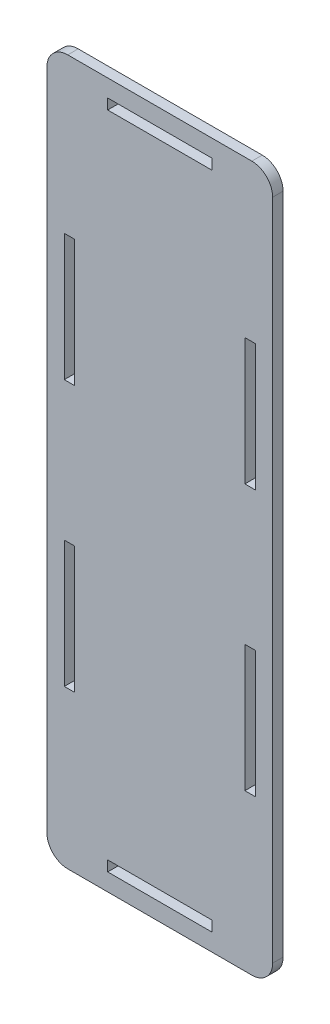
ISO-10303-21;
HEADER;
FILE_DESCRIPTION(('STEP AP214'),'2;1');
FILE_NAME('part.step','',(''),(''),'','','');
FILE_SCHEMA(('AUTOMOTIVE_DESIGN { 1 0 10303 214 1 1 1 1 }'));
ENDSEC;
DATA;
#1=APPLICATION_CONTEXT('core data for automotive mechanical design processes');
#2=APPLICATION_PROTOCOL_DEFINITION('international standard','automotive_design',2000,#1);
#3=PRODUCT_CONTEXT('',#1,'mechanical');
#4=PRODUCT('Part','Part','',(#3));
#5=PRODUCT_RELATED_PRODUCT_CATEGORY('part','',(#4));
#6=PRODUCT_DEFINITION_FORMATION('','',#4);
#7=PRODUCT_DEFINITION_CONTEXT('part definition',#1,'design');
#8=PRODUCT_DEFINITION('design','',#6,#7);
#9=PRODUCT_DEFINITION_SHAPE('','',#8);
#10=(LENGTH_UNIT() NAMED_UNIT(*) SI_UNIT(.MILLI.,.METRE.));
#11=(NAMED_UNIT(*) PLANE_ANGLE_UNIT() SI_UNIT($,.RADIAN.));
#12=(NAMED_UNIT(*) SI_UNIT($,.STERADIAN.) SOLID_ANGLE_UNIT());
#13=UNCERTAINTY_MEASURE_WITH_UNIT(LENGTH_MEASURE(1.E-05),#10,'distance_accuracy_value','');
#14=(GEOMETRIC_REPRESENTATION_CONTEXT(3) GLOBAL_UNCERTAINTY_ASSIGNED_CONTEXT((#13)) GLOBAL_UNIT_ASSIGNED_CONTEXT((#10,
#11,#12)) REPRESENTATION_CONTEXT('',''));
#15=CARTESIAN_POINT('',(0.,0.,0.));
#16=DIRECTION('',(0.,0.,1.));
#17=DIRECTION('',(1.,0.,0.));
#18=AXIS2_PLACEMENT_3D('',#15,#16,#17);
#19=CARTESIAN_POINT('',(-26.5,-95.5,3.));
#20=DIRECTION('',(0.,0.,-1.));
#21=DIRECTION('',(-1.,0.,0.));
#22=AXIS2_PLACEMENT_3D('',#19,#20,#21);
#23=PLANE('',#22);
#24=DIRECTION('',(0.,1.,0.));
#25=VECTOR('',#24,1.);
#26=CARTESIAN_POINT('',(27.5,-56.5,3.));
#27=LINE('',#26,#25);
#28=CARTESIAN_POINT('',(27.5,-56.5,3.));
#29=VERTEX_POINT('',#28);
#30=CARTESIAN_POINT('',(27.5,-20.,3.));
#31=VERTEX_POINT('',#30);
#32=EDGE_CURVE('E325',#29,#31,#27,.T.);
#33=ORIENTED_EDGE('',*,*,#32,.F.);
#34=DIRECTION('',(1.,0.,0.));
#35=VECTOR('',#34,1.);
#36=CARTESIAN_POINT('',(24.5,-56.5,3.));
#37=LINE('',#36,#35);
#38=CARTESIAN_POINT('',(24.5,-56.5,3.));
#39=VERTEX_POINT('',#38);
#40=EDGE_CURVE('E48',#39,#29,#37,.T.);
#41=ORIENTED_EDGE('',*,*,#40,.F.);
#42=DIRECTION('',(0.,1.,0.));
#43=VECTOR('',#42,1.);
#44=CARTESIAN_POINT('',(24.5,-56.5,3.));
#45=LINE('',#44,#43);
#46=CARTESIAN_POINT('',(24.5,-20.,3.));
#47=VERTEX_POINT('',#46);
#48=EDGE_CURVE('E318',#39,#47,#45,.T.);
#49=ORIENTED_EDGE('',*,*,#48,.T.);
#50=DIRECTION('',(1.,0.,0.));
#51=VECTOR('',#50,1.);
#52=CARTESIAN_POINT('',(24.5,-20.,3.));
#53=LINE('',#52,#51);
#54=EDGE_CURVE('E321',#47,#31,#53,.T.);
#55=ORIENTED_EDGE('',*,*,#54,.T.);
#56=EDGE_LOOP('',(#33,#41,#49,#55));
#57=FACE_BOUND('',#56,.T.);
#58=DIRECTION('',(0.,1.,0.));
#59=VECTOR('',#58,1.);
#60=CARTESIAN_POINT('',(15.,0.,3.));
#61=LINE('',#60,#59);
#62=CARTESIAN_POINT('',(15.,93.5,3.));
#63=VERTEX_POINT('',#62);
#64=CARTESIAN_POINT('',(15.,96.5,3.));
#65=VERTEX_POINT('',#64);
#66=EDGE_CURVE('E296',#63,#65,#61,.T.);
#67=ORIENTED_EDGE('',*,*,#66,.F.);
#68=DIRECTION('',(1.,0.,0.));
#69=VECTOR('',#68,1.);
#70=CARTESIAN_POINT('',(0.,93.5,3.));
#71=LINE('',#70,#69);
#72=CARTESIAN_POINT('',(-15.,93.5,3.));
#73=VERTEX_POINT('',#72);
#74=EDGE_CURVE('E56',#73,#63,#71,.T.);
#75=ORIENTED_EDGE('',*,*,#74,.F.);
#76=DIRECTION('',(0.,1.,0.));
#77=VECTOR('',#76,1.);
#78=CARTESIAN_POINT('',(-15.,0.,3.));
#79=LINE('',#78,#77);
#80=CARTESIAN_POINT('',(-15.,96.5,3.));
#81=VERTEX_POINT('',#80);
#82=EDGE_CURVE('E289',#73,#81,#79,.T.);
#83=ORIENTED_EDGE('',*,*,#82,.T.);
#84=DIRECTION('',(1.,0.,0.));
#85=VECTOR('',#84,1.);
#86=CARTESIAN_POINT('',(0.,96.5,3.));
#87=LINE('',#86,#85);
#88=EDGE_CURVE('E292',#81,#65,#87,.T.);
#89=ORIENTED_EDGE('',*,*,#88,.T.);
#90=EDGE_LOOP('',(#67,#75,#83,#89));
#91=FACE_BOUND('',#90,.T.);
#92=DIRECTION('',(1.,0.,0.));
#93=VECTOR('',#92,1.);
#94=CARTESIAN_POINT('',(24.5,56.5,3.));
#95=LINE('',#94,#93);
#96=CARTESIAN_POINT('',(24.5,56.5,3.));
#97=VERTEX_POINT('',#96);
#98=CARTESIAN_POINT('',(27.5,56.5,3.));
#99=VERTEX_POINT('',#98);
#100=EDGE_CURVE('E268',#97,#99,#95,.T.);
#101=ORIENTED_EDGE('',*,*,#100,.T.);
#102=DIRECTION('',(0.,-1.,0.));
#103=VECTOR('',#102,1.);
#104=CARTESIAN_POINT('',(27.5,56.5,3.));
#105=LINE('',#104,#103);
#106=CARTESIAN_POINT('',(27.5,20.,3.));
#107=VERTEX_POINT('',#106);
#108=EDGE_CURVE('E266',#99,#107,#105,.T.);
#109=ORIENTED_EDGE('',*,*,#108,.T.);
#110=DIRECTION('',(1.,0.,0.));
#111=VECTOR('',#110,1.);
#112=CARTESIAN_POINT('',(24.5,20.,3.));
#113=LINE('',#112,#111);
#114=CARTESIAN_POINT('',(24.5,20.,3.));
#115=VERTEX_POINT('',#114);
#116=EDGE_CURVE('E247',#115,#107,#113,.T.);
#117=ORIENTED_EDGE('',*,*,#116,.F.);
#118=DIRECTION('',(0.,-1.,0.));
#119=VECTOR('',#118,1.);
#120=CARTESIAN_POINT('',(24.5,56.5,3.));
#121=LINE('',#120,#119);
#122=EDGE_CURVE('E259',#97,#115,#121,.T.);
#123=ORIENTED_EDGE('',*,*,#122,.F.);
#124=EDGE_LOOP('',(#101,#109,#117,#123));
#125=FACE_BOUND('',#124,.T.);
#126=CARTESIAN_POINT('',(-26.5,-95.5,3.));
#127=DIRECTION('',(0.,0.,1.));
#128=DIRECTION('',(-1.,0.,0.));
#129=AXIS2_PLACEMENT_3D('',#126,#127,#128);
#130=CIRCLE('',#129,6.);
#131=CARTESIAN_POINT('',(-32.5,-95.5,3.));
#132=VERTEX_POINT('',#131);
#133=CARTESIAN_POINT('',(-26.4999999999999,-101.5,3.));
#134=VERTEX_POINT('',#133);
#135=EDGE_CURVE('E433',#132,#134,#130,.T.);
#136=ORIENTED_EDGE('',*,*,#135,.T.);
#137=DIRECTION('',(1.,0.,0.));
#138=VECTOR('',#137,1.);
#139=CARTESIAN_POINT('',(-26.4999999999999,-101.5,3.));
#140=LINE('',#139,#138);
#141=CARTESIAN_POINT('',(26.5,-101.5,3.));
#142=VERTEX_POINT('',#141);
#143=EDGE_CURVE('E436',#134,#142,#140,.T.);
#144=ORIENTED_EDGE('',*,*,#143,.T.);
#145=CARTESIAN_POINT('',(26.5,-95.5,3.));
#146=DIRECTION('',(0.,0.,1.));
#147=DIRECTION('',(1.,0.,0.));
#148=AXIS2_PLACEMENT_3D('',#145,#146,#147);
#149=CIRCLE('',#148,6.);
#150=CARTESIAN_POINT('',(32.5,-95.5,3.));
#151=VERTEX_POINT('',#150);
#152=EDGE_CURVE('E439',#142,#151,#149,.T.);
#153=ORIENTED_EDGE('',*,*,#152,.T.);
#154=DIRECTION('',(0.,1.,0.));
#155=VECTOR('',#154,1.);
#156=CARTESIAN_POINT('',(32.5,95.4999999999999,3.));
#157=LINE('',#156,#155);
#158=CARTESIAN_POINT('',(32.5,95.4999999999999,3.));
#159=VERTEX_POINT('',#158);
#160=EDGE_CURVE('E441',#151,#159,#157,.T.);
#161=ORIENTED_EDGE('',*,*,#160,.T.);
#162=CARTESIAN_POINT('',(26.5,95.5,3.));
#163=DIRECTION('',(0.,0.,1.));
#164=DIRECTION('',(-1.,0.,0.));
#165=AXIS2_PLACEMENT_3D('',#162,#163,#164);
#166=CIRCLE('',#165,6.);
#167=CARTESIAN_POINT('',(26.4999999999999,101.5,3.));
#168=VERTEX_POINT('',#167);
#169=EDGE_CURVE('E443',#159,#168,#166,.T.);
#170=ORIENTED_EDGE('',*,*,#169,.T.);
#171=DIRECTION('',(-1.,0.,0.));
#172=VECTOR('',#171,1.);
#173=CARTESIAN_POINT('',(-26.5,101.5,3.));
#174=LINE('',#173,#172);
#175=CARTESIAN_POINT('',(-26.5,101.5,3.));
#176=VERTEX_POINT('',#175);
#177=EDGE_CURVE('E445',#168,#176,#174,.T.);
#178=ORIENTED_EDGE('',*,*,#177,.T.);
#179=CARTESIAN_POINT('',(-26.5,95.5,3.));
#180=DIRECTION('',(0.,0.,1.));
#181=DIRECTION('',(1.,0.,0.));
#182=AXIS2_PLACEMENT_3D('',#179,#180,#181);
#183=CIRCLE('',#182,6.);
#184=CARTESIAN_POINT('',(-32.5,95.4999999999999,3.));
#185=VERTEX_POINT('',#184);
#186=EDGE_CURVE('E447',#176,#185,#183,.T.);
#187=ORIENTED_EDGE('',*,*,#186,.T.);
#188=DIRECTION('',(0.,-1.,0.));
#189=VECTOR('',#188,1.);
#190=CARTESIAN_POINT('',(-32.5,95.4999999999999,3.));
#191=LINE('',#190,#189);
#192=EDGE_CURVE('E449',#185,#132,#191,.T.);
#193=ORIENTED_EDGE('',*,*,#192,.T.);
#194=EDGE_LOOP('',(#136,#144,#153,#161,#170,#178,#187,#193));
#195=FACE_BOUND('',#194,.T.);
#196=DIRECTION('',(0.,-1.,0.));
#197=VECTOR('',#196,1.);
#198=CARTESIAN_POINT('',(-24.5,0.,3.));
#199=LINE('',#198,#197);
#200=CARTESIAN_POINT('',(-24.5,56.5,3.));
#201=VERTEX_POINT('',#200);
#202=CARTESIAN_POINT('',(-24.5,20.,3.));
#203=VERTEX_POINT('',#202);
#204=EDGE_CURVE('E361',#201,#203,#199,.T.);
#205=ORIENTED_EDGE('',*,*,#204,.T.);
#206=DIRECTION('',(-1.,0.,0.));
#207=VECTOR('',#206,1.);
#208=CARTESIAN_POINT('',(0.,20.,3.));
#209=LINE('',#208,#207);
#210=CARTESIAN_POINT('',(-27.5,20.,3.));
#211=VERTEX_POINT('',#210);
#212=EDGE_CURVE('E404',#203,#211,#209,.T.);
#213=ORIENTED_EDGE('',*,*,#212,.T.);
#214=DIRECTION('',(0.,-1.,0.));
#215=VECTOR('',#214,1.);
#216=CARTESIAN_POINT('',(-27.5,0.,3.));
#217=LINE('',#216,#215);
#218=CARTESIAN_POINT('',(-27.5,56.5,3.));
#219=VERTEX_POINT('',#218);
#220=EDGE_CURVE('E418',#219,#211,#217,.T.);
#221=ORIENTED_EDGE('',*,*,#220,.F.);
#222=DIRECTION('',(-1.,0.,0.));
#223=VECTOR('',#222,1.);
#224=CARTESIAN_POINT('',(0.,56.5,3.));
#225=LINE('',#224,#223);
#226=EDGE_CURVE('E415',#201,#219,#225,.T.);
#227=ORIENTED_EDGE('',*,*,#226,.F.);
#228=EDGE_LOOP('',(#205,#213,#221,#227));
#229=FACE_BOUND('',#228,.T.);
#230=DIRECTION('',(-1.,0.,0.));
#231=VECTOR('',#230,1.);
#232=CARTESIAN_POINT('',(0.,-20.,3.));
#233=LINE('',#232,#231);
#234=CARTESIAN_POINT('',(-24.5,-20.,3.));
#235=VERTEX_POINT('',#234);
#236=CARTESIAN_POINT('',(-27.5,-20.,3.));
#237=VERTEX_POINT('',#236);
#238=EDGE_CURVE('E356',#235,#237,#233,.T.);
#239=ORIENTED_EDGE('',*,*,#238,.F.);
#240=DIRECTION('',(0.,1.,0.));
#241=VECTOR('',#240,1.);
#242=CARTESIAN_POINT('',(-24.5,0.,3.));
#243=LINE('',#242,#241);
#244=CARTESIAN_POINT('',(-24.5,-56.5,3.));
#245=VERTEX_POINT('',#244);
#246=EDGE_CURVE('E359',#245,#235,#243,.T.);
#247=ORIENTED_EDGE('',*,*,#246,.F.);
#248=DIRECTION('',(-1.,0.,0.));
#249=VECTOR('',#248,1.);
#250=CARTESIAN_POINT('',(0.,-56.5,3.));
#251=LINE('',#250,#249);
#252=CARTESIAN_POINT('',(-27.5,-56.5,3.));
#253=VERTEX_POINT('',#252);
#254=EDGE_CURVE('E349',#245,#253,#251,.T.);
#255=ORIENTED_EDGE('',*,*,#254,.T.);
#256=DIRECTION('',(0.,-1.,0.));
#257=VECTOR('',#256,1.);
#258=CARTESIAN_POINT('',(-27.5,0.,3.));
#259=LINE('',#258,#257);
#260=EDGE_CURVE('E352',#237,#253,#259,.T.);
#261=ORIENTED_EDGE('',*,*,#260,.F.);
#262=EDGE_LOOP('',(#239,#247,#255,#261));
#263=FACE_BOUND('',#262,.T.);
#264=DIRECTION('',(1.,0.,0.));
#265=VECTOR('',#264,1.);
#266=CARTESIAN_POINT('',(0.,-93.5,3.));
#267=LINE('',#266,#265);
#268=CARTESIAN_POINT('',(-15.,-93.5,3.));
#269=VERTEX_POINT('',#268);
#270=CARTESIAN_POINT('',(15.,-93.5,3.));
#271=VERTEX_POINT('',#270);
#272=EDGE_CURVE('E348',#269,#271,#267,.T.);
#273=ORIENTED_EDGE('',*,*,#272,.T.);
#274=DIRECTION('',(0.,-1.,0.));
#275=VECTOR('',#274,1.);
#276=CARTESIAN_POINT('',(15.,0.,3.));
#277=LINE('',#276,#275);
#278=CARTESIAN_POINT('',(15.,-96.5,3.));
#279=VERTEX_POINT('',#278);
#280=EDGE_CURVE('E381',#271,#279,#277,.T.);
#281=ORIENTED_EDGE('',*,*,#280,.T.);
#282=DIRECTION('',(1.,0.,0.));
#283=VECTOR('',#282,1.);
#284=CARTESIAN_POINT('',(0.,-96.5,3.));
#285=LINE('',#284,#283);
#286=CARTESIAN_POINT('',(-15.,-96.5,3.));
#287=VERTEX_POINT('',#286);
#288=EDGE_CURVE('E384',#287,#279,#285,.T.);
#289=ORIENTED_EDGE('',*,*,#288,.F.);
#290=DIRECTION('',(0.,-1.,0.));
#291=VECTOR('',#290,1.);
#292=CARTESIAN_POINT('',(-15.,0.,3.));
#293=LINE('',#292,#291);
#294=EDGE_CURVE('E388',#269,#287,#293,.T.);
#295=ORIENTED_EDGE('',*,*,#294,.F.);
#296=EDGE_LOOP('',(#273,#281,#289,#295));
#297=FACE_BOUND('',#296,.T.);
#298=ADVANCED_FACE('F33',(#57,#91,#125,#195,#229,#263,#297),#23,.F.);
#299=CARTESIAN_POINT('',(-26.5,-95.5,0.));
#300=DIRECTION('',(0.,0.,-1.));
#301=DIRECTION('',(-1.,0.,0.));
#302=AXIS2_PLACEMENT_3D('',#299,#300,#301);
#303=PLANE('',#302);
#304=DIRECTION('',(1.,0.,0.));
#305=VECTOR('',#304,1.);
#306=CARTESIAN_POINT('',(24.5,-56.5,0.));
#307=LINE('',#306,#305);
#308=CARTESIAN_POINT('',(24.5,-56.5,0.));
#309=VERTEX_POINT('',#308);
#310=CARTESIAN_POINT('',(27.5,-56.5,0.));
#311=VERTEX_POINT('',#310);
#312=EDGE_CURVE('E322',#309,#311,#307,.T.);
#313=ORIENTED_EDGE('',*,*,#312,.T.);
#314=DIRECTION('',(0.,1.,0.));
#315=VECTOR('',#314,1.);
#316=CARTESIAN_POINT('',(27.5,-56.5,0.));
#317=LINE('',#316,#315);
#318=CARTESIAN_POINT('',(27.5,-20.,0.));
#319=VERTEX_POINT('',#318);
#320=EDGE_CURVE('E333',#311,#319,#317,.T.);
#321=ORIENTED_EDGE('',*,*,#320,.T.);
#322=DIRECTION('',(1.,0.,0.));
#323=VECTOR('',#322,1.);
#324=CARTESIAN_POINT('',(24.5,-20.,0.));
#325=LINE('',#324,#323);
#326=CARTESIAN_POINT('',(24.5,-20.,0.));
#327=VERTEX_POINT('',#326);
#328=EDGE_CURVE('E330',#327,#319,#325,.T.);
#329=ORIENTED_EDGE('',*,*,#328,.F.);
#330=DIRECTION('',(0.,1.,0.));
#331=VECTOR('',#330,1.);
#332=CARTESIAN_POINT('',(24.5,-56.5,0.));
#333=LINE('',#332,#331);
#334=EDGE_CURVE('E312',#309,#327,#333,.T.);
#335=ORIENTED_EDGE('',*,*,#334,.F.);
#336=EDGE_LOOP('',(#313,#321,#329,#335));
#337=FACE_BOUND('',#336,.T.);
#338=DIRECTION('',(1.,0.,0.));
#339=VECTOR('',#338,1.);
#340=CARTESIAN_POINT('',(0.,93.5,0.));
#341=LINE('',#340,#339);
#342=CARTESIAN_POINT('',(-15.,93.5,0.));
#343=VERTEX_POINT('',#342);
#344=CARTESIAN_POINT('',(15.,93.5,0.));
#345=VERTEX_POINT('',#344);
#346=EDGE_CURVE('E293',#343,#345,#341,.T.);
#347=ORIENTED_EDGE('',*,*,#346,.T.);
#348=DIRECTION('',(0.,1.,0.));
#349=VECTOR('',#348,1.);
#350=CARTESIAN_POINT('',(15.,0.,0.));
#351=LINE('',#350,#349);
#352=CARTESIAN_POINT('',(15.,96.5,0.));
#353=VERTEX_POINT('',#352);
#354=EDGE_CURVE('E305',#345,#353,#351,.T.);
#355=ORIENTED_EDGE('',*,*,#354,.T.);
#356=DIRECTION('',(1.,0.,0.));
#357=VECTOR('',#356,1.);
#358=CARTESIAN_POINT('',(0.,96.5,0.));
#359=LINE('',#358,#357);
#360=CARTESIAN_POINT('',(-15.,96.5,0.));
#361=VERTEX_POINT('',#360);
#362=EDGE_CURVE('E302',#361,#353,#359,.T.);
#363=ORIENTED_EDGE('',*,*,#362,.F.);
#364=DIRECTION('',(0.,1.,0.));
#365=VECTOR('',#364,1.);
#366=CARTESIAN_POINT('',(-15.,0.,0.));
#367=LINE('',#366,#365);
#368=EDGE_CURVE('E282',#343,#361,#367,.T.);
#369=ORIENTED_EDGE('',*,*,#368,.F.);
#370=EDGE_LOOP('',(#347,#355,#363,#369));
#371=FACE_BOUND('',#370,.T.);
#372=DIRECTION('',(0.,1.,0.));
#373=VECTOR('',#372,1.);
#374=CARTESIAN_POINT('',(-24.5,0.,0.));
#375=LINE('',#374,#373);
#376=CARTESIAN_POINT('',(-24.5,-56.5,0.));
#377=VERTEX_POINT('',#376);
#378=CARTESIAN_POINT('',(-24.5,-20.,0.));
#379=VERTEX_POINT('',#378);
#380=EDGE_CURVE('E353',#377,#379,#375,.T.);
#381=ORIENTED_EDGE('',*,*,#380,.T.);
#382=DIRECTION('',(-1.,0.,0.));
#383=VECTOR('',#382,1.);
#384=CARTESIAN_POINT('',(0.,-20.,0.));
#385=LINE('',#384,#383);
#386=CARTESIAN_POINT('',(-27.5,-20.,0.));
#387=VERTEX_POINT('',#386);
#388=EDGE_CURVE('E366',#379,#387,#385,.T.);
#389=ORIENTED_EDGE('',*,*,#388,.T.);
#390=DIRECTION('',(0.,-1.,0.));
#391=VECTOR('',#390,1.);
#392=CARTESIAN_POINT('',(-27.5,0.,0.));
#393=LINE('',#392,#391);
#394=CARTESIAN_POINT('',(-27.5,-56.5,0.));
#395=VERTEX_POINT('',#394);
#396=EDGE_CURVE('E363',#387,#395,#393,.T.);
#397=ORIENTED_EDGE('',*,*,#396,.T.);
#398=DIRECTION('',(-1.,0.,0.));
#399=VECTOR('',#398,1.);
#400=CARTESIAN_POINT('',(0.,-56.5,0.));
#401=LINE('',#400,#399);
#402=EDGE_CURVE('E341',#377,#395,#401,.T.);
#403=ORIENTED_EDGE('',*,*,#402,.F.);
#404=EDGE_LOOP('',(#381,#389,#397,#403));
#405=FACE_BOUND('',#404,.T.);
#406=CARTESIAN_POINT('',(-26.5,-95.5,0.));
#407=DIRECTION('',(0.,0.,1.));
#408=DIRECTION('',(-1.,0.,0.));
#409=AXIS2_PLACEMENT_3D('',#406,#407,#408);
#410=CIRCLE('',#409,6.);
#411=CARTESIAN_POINT('',(-32.5,-95.5,0.));
#412=VERTEX_POINT('',#411);
#413=CARTESIAN_POINT('',(-26.4999999999999,-101.5,0.));
#414=VERTEX_POINT('',#413);
#415=EDGE_CURVE('E426',#412,#414,#410,.T.);
#416=ORIENTED_EDGE('',*,*,#415,.F.);
#417=DIRECTION('',(0.,-1.,0.));
#418=VECTOR('',#417,1.);
#419=CARTESIAN_POINT('',(-32.5,95.4999999999999,0.));
#420=LINE('',#419,#418);
#421=CARTESIAN_POINT('',(-32.5,95.4999999999999,0.));
#422=VERTEX_POINT('',#421);
#423=EDGE_CURVE('E437',#422,#412,#420,.T.);
#424=ORIENTED_EDGE('',*,*,#423,.F.);
#425=CARTESIAN_POINT('',(-26.5,95.5,0.));
#426=DIRECTION('',(0.,0.,1.));
#427=DIRECTION('',(1.,0.,0.));
#428=AXIS2_PLACEMENT_3D('',#425,#426,#427);
#429=CIRCLE('',#428,6.);
#430=CARTESIAN_POINT('',(-26.5,101.5,0.));
#431=VERTEX_POINT('',#430);
#432=EDGE_CURVE('E464',#431,#422,#429,.T.);
#433=ORIENTED_EDGE('',*,*,#432,.F.);
#434=DIRECTION('',(-1.,0.,0.));
#435=VECTOR('',#434,1.);
#436=CARTESIAN_POINT('',(-26.5,101.5,0.));
#437=LINE('',#436,#435);
#438=CARTESIAN_POINT('',(26.4999999999999,101.5,0.));
#439=VERTEX_POINT('',#438);
#440=EDGE_CURVE('E462',#439,#431,#437,.T.);
#441=ORIENTED_EDGE('',*,*,#440,.F.);
#442=CARTESIAN_POINT('',(26.5,95.5,0.));
#443=DIRECTION('',(0.,0.,1.));
#444=DIRECTION('',(-1.,0.,0.));
#445=AXIS2_PLACEMENT_3D('',#442,#443,#444);
#446=CIRCLE('',#445,6.);
#447=CARTESIAN_POINT('',(32.5,95.4999999999999,0.));
#448=VERTEX_POINT('',#447);
#449=EDGE_CURVE('E460',#448,#439,#446,.T.);
#450=ORIENTED_EDGE('',*,*,#449,.F.);
#451=DIRECTION('',(0.,1.,0.));
#452=VECTOR('',#451,1.);
#453=CARTESIAN_POINT('',(32.5,95.4999999999999,0.));
#454=LINE('',#453,#452);
#455=CARTESIAN_POINT('',(32.5,-95.5,0.));
#456=VERTEX_POINT('',#455);
#457=EDGE_CURVE('E458',#456,#448,#454,.T.);
#458=ORIENTED_EDGE('',*,*,#457,.F.);
#459=CARTESIAN_POINT('',(26.5,-95.5,0.));
#460=DIRECTION('',(0.,0.,1.));
#461=DIRECTION('',(1.,0.,0.));
#462=AXIS2_PLACEMENT_3D('',#459,#460,#461);
#463=CIRCLE('',#462,6.);
#464=CARTESIAN_POINT('',(26.5,-101.5,0.));
#465=VERTEX_POINT('',#464);
#466=EDGE_CURVE('E456',#465,#456,#463,.T.);
#467=ORIENTED_EDGE('',*,*,#466,.F.);
#468=DIRECTION('',(1.,0.,0.));
#469=VECTOR('',#468,1.);
#470=CARTESIAN_POINT('',(-26.4999999999999,-101.5,0.));
#471=LINE('',#470,#469);
#472=EDGE_CURVE('E454',#414,#465,#471,.T.);
#473=ORIENTED_EDGE('',*,*,#472,.F.);
#474=EDGE_LOOP('',(#416,#424,#433,#441,#450,#458,#467,#473));
#475=FACE_BOUND('',#474,.T.);
#476=DIRECTION('',(-1.,0.,0.));
#477=VECTOR('',#476,1.);
#478=CARTESIAN_POINT('',(0.,20.,0.));
#479=LINE('',#478,#477);
#480=CARTESIAN_POINT('',(-24.5,20.,0.));
#481=VERTEX_POINT('',#480);
#482=CARTESIAN_POINT('',(-27.5,20.,0.));
#483=VERTEX_POINT('',#482);
#484=EDGE_CURVE('E410',#481,#483,#479,.T.);
#485=ORIENTED_EDGE('',*,*,#484,.F.);
#486=DIRECTION('',(0.,-1.,0.));
#487=VECTOR('',#486,1.);
#488=CARTESIAN_POINT('',(-24.5,0.,0.));
#489=LINE('',#488,#487);
#490=CARTESIAN_POINT('',(-24.5,56.5,0.));
#491=VERTEX_POINT('',#490);
#492=EDGE_CURVE('E401',#491,#481,#489,.T.);
#493=ORIENTED_EDGE('',*,*,#492,.F.);
#494=DIRECTION('',(-1.,0.,0.));
#495=VECTOR('',#494,1.);
#496=CARTESIAN_POINT('',(0.,56.5,0.));
#497=LINE('',#496,#495);
#498=CARTESIAN_POINT('',(-27.5,56.5,0.));
#499=VERTEX_POINT('',#498);
#500=EDGE_CURVE('E403',#491,#499,#497,.T.);
#501=ORIENTED_EDGE('',*,*,#500,.T.);
#502=DIRECTION('',(0.,-1.,0.));
#503=VECTOR('',#502,1.);
#504=CARTESIAN_POINT('',(-27.5,0.,0.));
#505=LINE('',#504,#503);
#506=EDGE_CURVE('E407',#499,#483,#505,.T.);
#507=ORIENTED_EDGE('',*,*,#506,.T.);
#508=EDGE_LOOP('',(#485,#493,#501,#507));
#509=FACE_BOUND('',#508,.T.);
#510=DIRECTION('',(0.,-1.,0.));
#511=VECTOR('',#510,1.);
#512=CARTESIAN_POINT('',(27.5,56.5,0.));
#513=LINE('',#512,#511);
#514=CARTESIAN_POINT('',(27.5,56.5,0.));
#515=VERTEX_POINT('',#514);
#516=CARTESIAN_POINT('',(27.5,20.,0.));
#517=VERTEX_POINT('',#516);
#518=EDGE_CURVE('E277',#515,#517,#513,.T.);
#519=ORIENTED_EDGE('',*,*,#518,.F.);
#520=DIRECTION('',(1.,0.,0.));
#521=VECTOR('',#520,1.);
#522=CARTESIAN_POINT('',(24.5,56.5,0.));
#523=LINE('',#522,#521);
#524=CARTESIAN_POINT('',(24.5,56.5,0.));
#525=VERTEX_POINT('',#524);
#526=EDGE_CURVE('E263',#525,#515,#523,.T.);
#527=ORIENTED_EDGE('',*,*,#526,.F.);
#528=DIRECTION('',(0.,-1.,0.));
#529=VECTOR('',#528,1.);
#530=CARTESIAN_POINT('',(24.5,56.5,0.));
#531=LINE('',#530,#529);
#532=CARTESIAN_POINT('',(24.5,20.,0.));
#533=VERTEX_POINT('',#532);
#534=EDGE_CURVE('E274',#525,#533,#531,.T.);
#535=ORIENTED_EDGE('',*,*,#534,.T.);
#536=DIRECTION('',(1.,0.,0.));
#537=VECTOR('',#536,1.);
#538=CARTESIAN_POINT('',(24.5,20.,0.));
#539=LINE('',#538,#537);
#540=EDGE_CURVE('E250',#533,#517,#539,.T.);
#541=ORIENTED_EDGE('',*,*,#540,.T.);
#542=EDGE_LOOP('',(#519,#527,#535,#541));
#543=FACE_BOUND('',#542,.T.);
#544=DIRECTION('',(0.,-1.,0.));
#545=VECTOR('',#544,1.);
#546=CARTESIAN_POINT('',(15.,0.,0.));
#547=LINE('',#546,#545);
#548=CARTESIAN_POINT('',(15.,-93.5,0.));
#549=VERTEX_POINT('',#548);
#550=CARTESIAN_POINT('',(15.,-96.5,0.));
#551=VERTEX_POINT('',#550);
#552=EDGE_CURVE('E374',#549,#551,#547,.T.);
#553=ORIENTED_EDGE('',*,*,#552,.F.);
#554=DIRECTION('',(1.,0.,0.));
#555=VECTOR('',#554,1.);
#556=CARTESIAN_POINT('',(0.,-93.5,0.));
#557=LINE('',#556,#555);
#558=CARTESIAN_POINT('',(-15.,-93.5,0.));
#559=VERTEX_POINT('',#558);
#560=EDGE_CURVE('E385',#559,#549,#557,.T.);
#561=ORIENTED_EDGE('',*,*,#560,.F.);
#562=DIRECTION('',(0.,-1.,0.));
#563=VECTOR('',#562,1.);
#564=CARTESIAN_POINT('',(-15.,0.,0.));
#565=LINE('',#564,#563);
#566=CARTESIAN_POINT('',(-15.,-96.5,0.));
#567=VERTEX_POINT('',#566);
#568=EDGE_CURVE('E397',#559,#567,#565,.T.);
#569=ORIENTED_EDGE('',*,*,#568,.T.);
#570=DIRECTION('',(1.,0.,0.));
#571=VECTOR('',#570,1.);
#572=CARTESIAN_POINT('',(0.,-96.5,0.));
#573=LINE('',#572,#571);
#574=EDGE_CURVE('E394',#567,#551,#573,.T.);
#575=ORIENTED_EDGE('',*,*,#574,.T.);
#576=EDGE_LOOP('',(#553,#561,#569,#575));
#577=FACE_BOUND('',#576,.T.);
#578=ADVANCED_FACE('F494',(#337,#371,#405,#475,#509,#543,#577),#303,.T.);
#579=CARTESIAN_POINT('',(-26.5,-95.5,3.));
#580=DIRECTION('',(0.,0.,-1.));
#581=DIRECTION('',(-1.,0.,0.));
#582=AXIS2_PLACEMENT_3D('',#579,#580,#581);
#583=CYLINDRICAL_SURFACE('',#582,6.);
#584=ORIENTED_EDGE('',*,*,#415,.T.);
#585=DIRECTION('',(0.,0.,-1.));
#586=VECTOR('',#585,1.);
#587=CARTESIAN_POINT('',(-26.4999999999999,-101.5,3.));
#588=LINE('',#587,#586);
#589=EDGE_CURVE('E11',#134,#414,#588,.T.);
#590=ORIENTED_EDGE('',*,*,#589,.F.);
#591=ORIENTED_EDGE('',*,*,#135,.F.);
#592=DIRECTION('',(0.,0.,-1.));
#593=VECTOR('',#592,1.);
#594=CARTESIAN_POINT('',(-32.5,-95.5,3.));
#595=LINE('',#594,#593);
#596=EDGE_CURVE('E451',#132,#412,#595,.T.);
#597=ORIENTED_EDGE('',*,*,#596,.T.);
#598=EDGE_LOOP('',(#584,#590,#591,#597));
#599=FACE_BOUND('',#598,.T.);
#600=ADVANCED_FACE('F35',(#599),#583,.T.);
#601=CARTESIAN_POINT('',(-26.4999999999999,-101.5,3.));
#602=DIRECTION('',(0.,1.,0.));
#603=DIRECTION('',(0.,0.,1.));
#604=AXIS2_PLACEMENT_3D('',#601,#602,#603);
#605=PLANE('',#604);
#606=ORIENTED_EDGE('',*,*,#472,.T.);
#607=DIRECTION('',(0.,0.,-1.));
#608=VECTOR('',#607,1.);
#609=CARTESIAN_POINT('',(26.5,-101.5,3.));
#610=LINE('',#609,#608);
#611=EDGE_CURVE('E41',#142,#465,#610,.T.);
#612=ORIENTED_EDGE('',*,*,#611,.F.);
#613=ORIENTED_EDGE('',*,*,#143,.F.);
#614=ORIENTED_EDGE('',*,*,#589,.T.);
#615=EDGE_LOOP('',(#606,#612,#613,#614));
#616=FACE_BOUND('',#615,.T.);
#617=ADVANCED_FACE('F511',(#616),#605,.F.);
#618=CARTESIAN_POINT('',(26.5,-95.5,3.));
#619=DIRECTION('',(0.,0.,-1.));
#620=DIRECTION('',(-1.,0.,0.));
#621=AXIS2_PLACEMENT_3D('',#618,#619,#620);
#622=CYLINDRICAL_SURFACE('',#621,6.);
#623=ORIENTED_EDGE('',*,*,#466,.T.);
#624=DIRECTION('',(0.,0.,-1.));
#625=VECTOR('',#624,1.);
#626=CARTESIAN_POINT('',(32.5,-95.5,3.));
#627=LINE('',#626,#625);
#628=EDGE_CURVE('E481',#151,#456,#627,.T.);
#629=ORIENTED_EDGE('',*,*,#628,.F.);
#630=ORIENTED_EDGE('',*,*,#152,.F.);
#631=ORIENTED_EDGE('',*,*,#611,.T.);
#632=EDGE_LOOP('',(#623,#629,#630,#631));
#633=FACE_BOUND('',#632,.T.);
#634=ADVANCED_FACE('F488',(#633),#622,.T.);
#635=CARTESIAN_POINT('',(32.5,95.4999999999999,3.));
#636=DIRECTION('',(-1.,0.,0.));
#637=DIRECTION('',(0.,-1.,0.));
#638=AXIS2_PLACEMENT_3D('',#635,#636,#637);
#639=PLANE('',#638);
#640=ORIENTED_EDGE('',*,*,#457,.T.);
#641=DIRECTION('',(0.,0.,-1.));
#642=VECTOR('',#641,1.);
#643=CARTESIAN_POINT('',(32.5,95.4999999999999,3.));
#644=LINE('',#643,#642);
#645=EDGE_CURVE('E478',#159,#448,#644,.T.);
#646=ORIENTED_EDGE('',*,*,#645,.F.);
#647=ORIENTED_EDGE('',*,*,#160,.F.);
#648=ORIENTED_EDGE('',*,*,#628,.T.);
#649=EDGE_LOOP('',(#640,#646,#647,#648));
#650=FACE_BOUND('',#649,.T.);
#651=ADVANCED_FACE('F500',(#650),#639,.F.);
#652=CARTESIAN_POINT('',(26.5,95.5,3.));
#653=DIRECTION('',(0.,0.,-1.));
#654=DIRECTION('',(-1.,0.,0.));
#655=AXIS2_PLACEMENT_3D('',#652,#653,#654);
#656=CYLINDRICAL_SURFACE('',#655,6.);
#657=ORIENTED_EDGE('',*,*,#449,.T.);
#658=DIRECTION('',(0.,0.,-1.));
#659=VECTOR('',#658,1.);
#660=CARTESIAN_POINT('',(26.4999999999999,101.5,3.));
#661=LINE('',#660,#659);
#662=EDGE_CURVE('E475',#168,#439,#661,.T.);
#663=ORIENTED_EDGE('',*,*,#662,.F.);
#664=ORIENTED_EDGE('',*,*,#169,.F.);
#665=ORIENTED_EDGE('',*,*,#645,.T.);
#666=EDGE_LOOP('',(#657,#663,#664,#665));
#667=FACE_BOUND('',#666,.T.);
#668=ADVANCED_FACE('F504',(#667),#656,.T.);
#669=CARTESIAN_POINT('',(-26.5,101.5,3.));
#670=DIRECTION('',(0.,-1.,0.));
#671=DIRECTION('',(0.,0.,-1.));
#672=AXIS2_PLACEMENT_3D('',#669,#670,#671);
#673=PLANE('',#672);
#674=ORIENTED_EDGE('',*,*,#440,.T.);
#675=DIRECTION('',(0.,0.,-1.));
#676=VECTOR('',#675,1.);
#677=CARTESIAN_POINT('',(-26.5,101.5,3.));
#678=LINE('',#677,#676);
#679=EDGE_CURVE('E472',#176,#431,#678,.T.);
#680=ORIENTED_EDGE('',*,*,#679,.F.);
#681=ORIENTED_EDGE('',*,*,#177,.F.);
#682=ORIENTED_EDGE('',*,*,#662,.T.);
#683=EDGE_LOOP('',(#674,#680,#681,#682));
#684=FACE_BOUND('',#683,.T.);
#685=ADVANCED_FACE('F524',(#684),#673,.F.);
#686=CARTESIAN_POINT('',(-26.5,95.5,3.));
#687=DIRECTION('',(0.,0.,-1.));
#688=DIRECTION('',(-1.,0.,0.));
#689=AXIS2_PLACEMENT_3D('',#686,#687,#688);
#690=CYLINDRICAL_SURFACE('',#689,6.);
#691=ORIENTED_EDGE('',*,*,#432,.T.);
#692=DIRECTION('',(0.,0.,-1.));
#693=VECTOR('',#692,1.);
#694=CARTESIAN_POINT('',(-32.5,95.4999999999999,3.));
#695=LINE('',#694,#693);
#696=EDGE_CURVE('E469',#185,#422,#695,.T.);
#697=ORIENTED_EDGE('',*,*,#696,.F.);
#698=ORIENTED_EDGE('',*,*,#186,.F.);
#699=ORIENTED_EDGE('',*,*,#679,.T.);
#700=EDGE_LOOP('',(#691,#697,#698,#699));
#701=FACE_BOUND('',#700,.T.);
#702=ADVANCED_FACE('F522',(#701),#690,.T.);
#703=CARTESIAN_POINT('',(-32.5,95.4999999999999,3.));
#704=DIRECTION('',(1.,0.,0.));
#705=DIRECTION('',(0.,1.,0.));
#706=AXIS2_PLACEMENT_3D('',#703,#704,#705);
#707=PLANE('',#706);
#708=ORIENTED_EDGE('',*,*,#423,.T.);
#709=ORIENTED_EDGE('',*,*,#596,.F.);
#710=ORIENTED_EDGE('',*,*,#192,.F.);
#711=ORIENTED_EDGE('',*,*,#696,.T.);
#712=EDGE_LOOP('',(#708,#709,#710,#711));
#713=FACE_BOUND('',#712,.T.);
#714=ADVANCED_FACE('F517',(#713),#707,.F.);
#715=CARTESIAN_POINT('',(-24.5,0.,0.));
#716=DIRECTION('',(-1.,0.,0.));
#717=DIRECTION('',(0.,-1.,0.));
#718=AXIS2_PLACEMENT_3D('',#715,#716,#717);
#719=PLANE('',#718);
#720=ORIENTED_EDGE('',*,*,#204,.F.);
#721=DIRECTION('',(0.,0.,1.));
#722=VECTOR('',#721,1.);
#723=CARTESIAN_POINT('',(-24.5,56.5,0.));
#724=LINE('',#723,#722);
#725=EDGE_CURVE('E412',#491,#201,#724,.T.);
#726=ORIENTED_EDGE('',*,*,#725,.F.);
#727=ORIENTED_EDGE('',*,*,#492,.T.);
#728=DIRECTION('',(0.,0.,1.));
#729=VECTOR('',#728,1.);
#730=CARTESIAN_POINT('',(-24.5,20.,0.));
#731=LINE('',#730,#729);
#732=EDGE_CURVE('E423',#481,#203,#731,.T.);
#733=ORIENTED_EDGE('',*,*,#732,.T.);
#734=EDGE_LOOP('',(#720,#726,#727,#733));
#735=FACE_BOUND('',#734,.T.);
#736=ADVANCED_FACE('F544',(#735),#719,.T.);
#737=CARTESIAN_POINT('',(0.,20.,0.));
#738=DIRECTION('',(0.,1.,0.));
#739=DIRECTION('',(0.,0.,1.));
#740=AXIS2_PLACEMENT_3D('',#737,#738,#739);
#741=PLANE('',#740);
#742=ORIENTED_EDGE('',*,*,#212,.F.);
#743=ORIENTED_EDGE('',*,*,#732,.F.);
#744=ORIENTED_EDGE('',*,*,#484,.T.);
#745=DIRECTION('',(0.,0.,1.));
#746=VECTOR('',#745,1.);
#747=CARTESIAN_POINT('',(-27.5,20.,0.));
#748=LINE('',#747,#746);
#749=EDGE_CURVE('E427',#483,#211,#748,.T.);
#750=ORIENTED_EDGE('',*,*,#749,.T.);
#751=EDGE_LOOP('',(#742,#743,#744,#750));
#752=FACE_BOUND('',#751,.T.);
#753=ADVANCED_FACE('F551',(#752),#741,.T.);
#754=CARTESIAN_POINT('',(-27.5,0.,0.));
#755=DIRECTION('',(-1.,0.,0.));
#756=DIRECTION('',(0.,-1.,0.));
#757=AXIS2_PLACEMENT_3D('',#754,#755,#756);
#758=PLANE('',#757);
#759=ORIENTED_EDGE('',*,*,#220,.T.);
#760=ORIENTED_EDGE('',*,*,#749,.F.);
#761=ORIENTED_EDGE('',*,*,#506,.F.);
#762=DIRECTION('',(0.,0.,1.));
#763=VECTOR('',#762,1.);
#764=CARTESIAN_POINT('',(-27.5,56.5,0.));
#765=LINE('',#764,#763);
#766=EDGE_CURVE('E429',#499,#219,#765,.T.);
#767=ORIENTED_EDGE('',*,*,#766,.T.);
#768=EDGE_LOOP('',(#759,#760,#761,#767));
#769=FACE_BOUND('',#768,.T.);
#770=ADVANCED_FACE('F556',(#769),#758,.F.);
#771=CARTESIAN_POINT('',(0.,56.5,0.));
#772=DIRECTION('',(0.,1.,0.));
#773=DIRECTION('',(0.,0.,1.));
#774=AXIS2_PLACEMENT_3D('',#771,#772,#773);
#775=PLANE('',#774);
#776=ORIENTED_EDGE('',*,*,#226,.T.);
#777=ORIENTED_EDGE('',*,*,#766,.F.);
#778=ORIENTED_EDGE('',*,*,#500,.F.);
#779=ORIENTED_EDGE('',*,*,#725,.T.);
#780=EDGE_LOOP('',(#776,#777,#778,#779));
#781=FACE_BOUND('',#780,.T.);
#782=ADVANCED_FACE('F563',(#781),#775,.F.);
#783=CARTESIAN_POINT('',(24.5,56.5,0.));
#784=DIRECTION('',(0.,-1.,0.));
#785=DIRECTION('',(0.,0.,-1.));
#786=AXIS2_PLACEMENT_3D('',#783,#784,#785);
#787=PLANE('',#786);
#788=ORIENTED_EDGE('',*,*,#100,.F.);
#789=DIRECTION('',(0.,0.,1.));
#790=VECTOR('',#789,1.);
#791=CARTESIAN_POINT('',(24.5,56.5,0.));
#792=LINE('',#791,#790);
#793=EDGE_CURVE('E254',#525,#97,#792,.T.);
#794=ORIENTED_EDGE('',*,*,#793,.F.);
#795=ORIENTED_EDGE('',*,*,#526,.T.);
#796=DIRECTION('',(0.,0.,1.));
#797=VECTOR('',#796,1.);
#798=CARTESIAN_POINT('',(27.5,56.5,0.));
#799=LINE('',#798,#797);
#800=EDGE_CURVE('E903',#515,#99,#799,.T.);
#801=ORIENTED_EDGE('',*,*,#800,.T.);
#802=EDGE_LOOP('',(#788,#794,#795,#801));
#803=FACE_BOUND('',#802,.T.);
#804=ADVANCED_FACE('F609',(#803),#787,.T.);
#805=CARTESIAN_POINT('',(27.5,56.5,0.));
#806=DIRECTION('',(-1.,0.,0.));
#807=DIRECTION('',(0.,-1.,0.));
#808=AXIS2_PLACEMENT_3D('',#805,#806,#807);
#809=PLANE('',#808);
#810=ORIENTED_EDGE('',*,*,#108,.F.);
#811=ORIENTED_EDGE('',*,*,#800,.F.);
#812=ORIENTED_EDGE('',*,*,#518,.T.);
#813=DIRECTION('',(0.,0.,1.));
#814=VECTOR('',#813,1.);
#815=CARTESIAN_POINT('',(27.5,20.,0.));
#816=LINE('',#815,#814);
#817=EDGE_CURVE('E255',#517,#107,#816,.T.);
#818=ORIENTED_EDGE('',*,*,#817,.T.);
#819=EDGE_LOOP('',(#810,#811,#812,#818));
#820=FACE_BOUND('',#819,.T.);
#821=ADVANCED_FACE('F613',(#820),#809,.T.);
#822=CARTESIAN_POINT('',(24.5,20.,0.));
#823=DIRECTION('',(0.,-1.,0.));
#824=DIRECTION('',(0.,0.,-1.));
#825=AXIS2_PLACEMENT_3D('',#822,#823,#824);
#826=PLANE('',#825);
#827=ORIENTED_EDGE('',*,*,#116,.T.);
#828=ORIENTED_EDGE('',*,*,#817,.F.);
#829=ORIENTED_EDGE('',*,*,#540,.F.);
#830=DIRECTION('',(0.,0.,1.));
#831=VECTOR('',#830,1.);
#832=CARTESIAN_POINT('',(24.5,20.,0.));
#833=LINE('',#832,#831);
#834=EDGE_CURVE('E242',#533,#115,#833,.T.);
#835=ORIENTED_EDGE('',*,*,#834,.T.);
#836=EDGE_LOOP('',(#827,#828,#829,#835));
#837=FACE_BOUND('',#836,.T.);
#838=ADVANCED_FACE('F244',(#837),#826,.F.);
#839=CARTESIAN_POINT('',(24.5,56.5,0.));
#840=DIRECTION('',(-1.,0.,0.));
#841=DIRECTION('',(0.,-1.,0.));
#842=AXIS2_PLACEMENT_3D('',#839,#840,#841);
#843=PLANE('',#842);
#844=ORIENTED_EDGE('',*,*,#122,.T.);
#845=ORIENTED_EDGE('',*,*,#834,.F.);
#846=ORIENTED_EDGE('',*,*,#534,.F.);
#847=ORIENTED_EDGE('',*,*,#793,.T.);
#848=EDGE_LOOP('',(#844,#845,#846,#847));
#849=FACE_BOUND('',#848,.T.);
#850=ADVANCED_FACE('F260',(#849),#843,.F.);
#851=CARTESIAN_POINT('',(-24.5,0.,0.));
#852=DIRECTION('',(1.,0.,0.));
#853=DIRECTION('',(0.,1.,0.));
#854=AXIS2_PLACEMENT_3D('',#851,#852,#853);
#855=PLANE('',#854);
#856=ORIENTED_EDGE('',*,*,#246,.T.);
#857=DIRECTION('',(0.,0.,1.));
#858=VECTOR('',#857,1.);
#859=CARTESIAN_POINT('',(-24.5,-20.,0.));
#860=LINE('',#859,#858);
#861=EDGE_CURVE('E338',#379,#235,#860,.T.);
#862=ORIENTED_EDGE('',*,*,#861,.F.);
#863=ORIENTED_EDGE('',*,*,#380,.F.);
#864=DIRECTION('',(0.,0.,1.));
#865=VECTOR('',#864,1.);
#866=CARTESIAN_POINT('',(-24.5,-56.5,0.));
#867=LINE('',#866,#865);
#868=EDGE_CURVE('E346',#377,#245,#867,.T.);
#869=ORIENTED_EDGE('',*,*,#868,.T.);
#870=EDGE_LOOP('',(#856,#862,#863,#869));
#871=FACE_BOUND('',#870,.T.);
#872=ADVANCED_FACE('F625',(#871),#855,.F.);
#873=CARTESIAN_POINT('',(0.,-56.5,0.));
#874=DIRECTION('',(0.,1.,0.));
#875=DIRECTION('',(0.,0.,1.));
#876=AXIS2_PLACEMENT_3D('',#873,#874,#875);
#877=PLANE('',#876);
#878=ORIENTED_EDGE('',*,*,#254,.F.);
#879=ORIENTED_EDGE('',*,*,#868,.F.);
#880=ORIENTED_EDGE('',*,*,#402,.T.);
#881=DIRECTION('',(0.,0.,1.));
#882=VECTOR('',#881,1.);
#883=CARTESIAN_POINT('',(-27.5,-56.5,0.));
#884=LINE('',#883,#882);
#885=EDGE_CURVE('E344',#395,#253,#884,.T.);
#886=ORIENTED_EDGE('',*,*,#885,.T.);
#887=EDGE_LOOP('',(#878,#879,#880,#886));
#888=FACE_BOUND('',#887,.T.);
#889=ADVANCED_FACE('F655',(#888),#877,.T.);
#890=CARTESIAN_POINT('',(-27.5,0.,0.));
#891=DIRECTION('',(-1.,0.,0.));
#892=DIRECTION('',(0.,-1.,0.));
#893=AXIS2_PLACEMENT_3D('',#890,#891,#892);
#894=PLANE('',#893);
#895=ORIENTED_EDGE('',*,*,#260,.T.);
#896=ORIENTED_EDGE('',*,*,#885,.F.);
#897=ORIENTED_EDGE('',*,*,#396,.F.);
#898=DIRECTION('',(0.,0.,1.));
#899=VECTOR('',#898,1.);
#900=CARTESIAN_POINT('',(-27.5,-20.,0.));
#901=LINE('',#900,#899);
#902=EDGE_CURVE('E342',#387,#237,#901,.T.);
#903=ORIENTED_EDGE('',*,*,#902,.T.);
#904=EDGE_LOOP('',(#895,#896,#897,#903));
#905=FACE_BOUND('',#904,.T.);
#906=ADVANCED_FACE('F660',(#905),#894,.F.);
#907=CARTESIAN_POINT('',(0.,-20.,0.));
#908=DIRECTION('',(0.,1.,0.));
#909=DIRECTION('',(0.,0.,1.));
#910=AXIS2_PLACEMENT_3D('',#907,#908,#909);
#911=PLANE('',#910);
#912=ORIENTED_EDGE('',*,*,#238,.T.);
#913=ORIENTED_EDGE('',*,*,#902,.F.);
#914=ORIENTED_EDGE('',*,*,#388,.F.);
#915=ORIENTED_EDGE('',*,*,#861,.T.);
#916=EDGE_LOOP('',(#912,#913,#914,#915));
#917=FACE_BOUND('',#916,.T.);
#918=ADVANCED_FACE('F657',(#917),#911,.F.);
#919=CARTESIAN_POINT('',(0.,-93.5,0.));
#920=DIRECTION('',(0.,-1.,0.));
#921=DIRECTION('',(0.,0.,-1.));
#922=AXIS2_PLACEMENT_3D('',#919,#920,#921);
#923=PLANE('',#922);
#924=ORIENTED_EDGE('',*,*,#272,.F.);
#925=DIRECTION('',(0.,0.,1.));
#926=VECTOR('',#925,1.);
#927=CARTESIAN_POINT('',(-15.,-93.5,0.));
#928=LINE('',#927,#926);
#929=EDGE_CURVE('E371',#559,#269,#928,.T.);
#930=ORIENTED_EDGE('',*,*,#929,.F.);
#931=ORIENTED_EDGE('',*,*,#560,.T.);
#932=DIRECTION('',(0.,0.,1.));
#933=VECTOR('',#932,1.);
#934=CARTESIAN_POINT('',(15.,-93.5,0.));
#935=LINE('',#934,#933);
#936=EDGE_CURVE('E300',#549,#271,#935,.T.);
#937=ORIENTED_EDGE('',*,*,#936,.T.);
#938=EDGE_LOOP('',(#924,#930,#931,#937));
#939=FACE_BOUND('',#938,.T.);
#940=ADVANCED_FACE('F588',(#939),#923,.T.);
#941=CARTESIAN_POINT('',(15.,0.,0.));
#942=DIRECTION('',(-1.,0.,0.));
#943=DIRECTION('',(0.,0.,1.));
#944=AXIS2_PLACEMENT_3D('',#941,#942,#943);
#945=PLANE('',#944);
#946=ORIENTED_EDGE('',*,*,#280,.F.);
#947=ORIENTED_EDGE('',*,*,#936,.F.);
#948=ORIENTED_EDGE('',*,*,#552,.T.);
#949=DIRECTION('',(0.,0.,1.));
#950=VECTOR('',#949,1.);
#951=CARTESIAN_POINT('',(15.,-96.5,0.));
#952=LINE('',#951,#950);
#953=EDGE_CURVE('E377',#551,#279,#952,.T.);
#954=ORIENTED_EDGE('',*,*,#953,.T.);
#955=EDGE_LOOP('',(#946,#947,#948,#954));
#956=FACE_BOUND('',#955,.T.);
#957=ADVANCED_FACE('F580',(#956),#945,.T.);
#958=CARTESIAN_POINT('',(0.,-96.5,0.));
#959=DIRECTION('',(0.,-1.,0.));
#960=DIRECTION('',(0.,0.,-1.));
#961=AXIS2_PLACEMENT_3D('',#958,#959,#960);
#962=PLANE('',#961);
#963=ORIENTED_EDGE('',*,*,#288,.T.);
#964=ORIENTED_EDGE('',*,*,#953,.F.);
#965=ORIENTED_EDGE('',*,*,#574,.F.);
#966=DIRECTION('',(0.,0.,1.));
#967=VECTOR('',#966,1.);
#968=CARTESIAN_POINT('',(-15.,-96.5,0.));
#969=LINE('',#968,#967);
#970=EDGE_CURVE('E375',#567,#287,#969,.T.);
#971=ORIENTED_EDGE('',*,*,#970,.T.);
#972=EDGE_LOOP('',(#963,#964,#965,#971));
#973=FACE_BOUND('',#972,.T.);
#974=ADVANCED_FACE('F582',(#973),#962,.F.);
#975=CARTESIAN_POINT('',(-15.,0.,0.));
#976=DIRECTION('',(-1.,0.,0.));
#977=DIRECTION('',(0.,0.,1.));
#978=AXIS2_PLACEMENT_3D('',#975,#976,#977);
#979=PLANE('',#978);
#980=ORIENTED_EDGE('',*,*,#294,.T.);
#981=ORIENTED_EDGE('',*,*,#970,.F.);
#982=ORIENTED_EDGE('',*,*,#568,.F.);
#983=ORIENTED_EDGE('',*,*,#929,.T.);
#984=EDGE_LOOP('',(#980,#981,#982,#983));
#985=FACE_BOUND('',#984,.T.);
#986=ADVANCED_FACE('F591',(#985),#979,.F.);
#987=CARTESIAN_POINT('',(0.,93.5,0.));
#988=DIRECTION('',(0.,-1.,0.));
#989=DIRECTION('',(0.,0.,-1.));
#990=AXIS2_PLACEMENT_3D('',#987,#988,#989);
#991=PLANE('',#990);
#992=ORIENTED_EDGE('',*,*,#74,.T.);
#993=DIRECTION('',(0.,0.,1.));
#994=VECTOR('',#993,1.);
#995=CARTESIAN_POINT('',(15.,93.5,0.));
#996=LINE('',#995,#994);
#997=EDGE_CURVE('E280',#345,#63,#996,.T.);
#998=ORIENTED_EDGE('',*,*,#997,.F.);
#999=ORIENTED_EDGE('',*,*,#346,.F.);
#1000=DIRECTION('',(0.,0.,1.));
#1001=VECTOR('',#1000,1.);
#1002=CARTESIAN_POINT('',(-15.,93.5,0.));
#1003=LINE('',#1002,#1001);
#1004=EDGE_CURVE('E287',#343,#73,#1003,.T.);
#1005=ORIENTED_EDGE('',*,*,#1004,.T.);
#1006=EDGE_LOOP('',(#992,#998,#999,#1005));
#1007=FACE_BOUND('',#1006,.T.);
#1008=ADVANCED_FACE('F593',(#1007),#991,.F.);
#1009=CARTESIAN_POINT('',(-15.,0.,0.));
#1010=DIRECTION('',(1.,0.,0.));
#1011=DIRECTION('',(0.,0.,-1.));
#1012=AXIS2_PLACEMENT_3D('',#1009,#1010,#1011);
#1013=PLANE('',#1012);
#1014=ORIENTED_EDGE('',*,*,#82,.F.);
#1015=ORIENTED_EDGE('',*,*,#1004,.F.);
#1016=ORIENTED_EDGE('',*,*,#368,.T.);
#1017=DIRECTION('',(0.,0.,1.));
#1018=VECTOR('',#1017,1.);
#1019=CARTESIAN_POINT('',(-15.,96.5,0.));
#1020=LINE('',#1019,#1018);
#1021=EDGE_CURVE('E285',#361,#81,#1020,.T.);
#1022=ORIENTED_EDGE('',*,*,#1021,.T.);
#1023=EDGE_LOOP('',(#1014,#1015,#1016,#1022));
#1024=FACE_BOUND('',#1023,.T.);
#1025=ADVANCED_FACE('F599',(#1024),#1013,.T.);
#1026=CARTESIAN_POINT('',(0.,96.5,0.));
#1027=DIRECTION('',(0.,-1.,0.));
#1028=DIRECTION('',(0.,0.,-1.));
#1029=AXIS2_PLACEMENT_3D('',#1026,#1027,#1028);
#1030=PLANE('',#1029);
#1031=ORIENTED_EDGE('',*,*,#88,.F.);
#1032=ORIENTED_EDGE('',*,*,#1021,.F.);
#1033=ORIENTED_EDGE('',*,*,#362,.T.);
#1034=DIRECTION('',(0.,0.,1.));
#1035=VECTOR('',#1034,1.);
#1036=CARTESIAN_POINT('',(15.,96.5,0.));
#1037=LINE('',#1036,#1035);
#1038=EDGE_CURVE('E283',#353,#65,#1037,.T.);
#1039=ORIENTED_EDGE('',*,*,#1038,.T.);
#1040=EDGE_LOOP('',(#1031,#1032,#1033,#1039));
#1041=FACE_BOUND('',#1040,.T.);
#1042=ADVANCED_FACE('F631',(#1041),#1030,.T.);
#1043=CARTESIAN_POINT('',(15.,0.,0.));
#1044=DIRECTION('',(1.,0.,0.));
#1045=DIRECTION('',(0.,0.,-1.));
#1046=AXIS2_PLACEMENT_3D('',#1043,#1044,#1045);
#1047=PLANE('',#1046);
#1048=ORIENTED_EDGE('',*,*,#66,.T.);
#1049=ORIENTED_EDGE('',*,*,#1038,.F.);
#1050=ORIENTED_EDGE('',*,*,#354,.F.);
#1051=ORIENTED_EDGE('',*,*,#997,.T.);
#1052=EDGE_LOOP('',(#1048,#1049,#1050,#1051));
#1053=FACE_BOUND('',#1052,.T.);
#1054=ADVANCED_FACE('F627',(#1053),#1047,.F.);
#1055=CARTESIAN_POINT('',(24.5,-56.5,0.));
#1056=DIRECTION('',(0.,-1.,0.));
#1057=DIRECTION('',(0.,0.,-1.));
#1058=AXIS2_PLACEMENT_3D('',#1055,#1056,#1057);
#1059=PLANE('',#1058);
#1060=ORIENTED_EDGE('',*,*,#40,.T.);
#1061=DIRECTION('',(0.,0.,1.));
#1062=VECTOR('',#1061,1.);
#1063=CARTESIAN_POINT('',(27.5,-56.5,0.));
#1064=LINE('',#1063,#1062);
#1065=EDGE_CURVE('E310',#311,#29,#1064,.T.);
#1066=ORIENTED_EDGE('',*,*,#1065,.F.);
#1067=ORIENTED_EDGE('',*,*,#312,.F.);
#1068=DIRECTION('',(0.,0.,1.));
#1069=VECTOR('',#1068,1.);
#1070=CARTESIAN_POINT('',(24.5,-56.5,0.));
#1071=LINE('',#1070,#1069);
#1072=EDGE_CURVE('E273',#309,#39,#1071,.T.);
#1073=ORIENTED_EDGE('',*,*,#1072,.T.);
#1074=EDGE_LOOP('',(#1060,#1066,#1067,#1073));
#1075=FACE_BOUND('',#1074,.T.);
#1076=ADVANCED_FACE('F630',(#1075),#1059,.F.);
#1077=CARTESIAN_POINT('',(24.5,-56.5,0.));
#1078=DIRECTION('',(1.,0.,0.));
#1079=DIRECTION('',(0.,1.,0.));
#1080=AXIS2_PLACEMENT_3D('',#1077,#1078,#1079);
#1081=PLANE('',#1080);
#1082=ORIENTED_EDGE('',*,*,#48,.F.);
#1083=ORIENTED_EDGE('',*,*,#1072,.F.);
#1084=ORIENTED_EDGE('',*,*,#334,.T.);
#1085=DIRECTION('',(0.,0.,1.));
#1086=VECTOR('',#1085,1.);
#1087=CARTESIAN_POINT('',(24.5,-20.,0.));
#1088=LINE('',#1087,#1086);
#1089=EDGE_CURVE('E315',#327,#47,#1088,.T.);
#1090=ORIENTED_EDGE('',*,*,#1089,.T.);
#1091=EDGE_LOOP('',(#1082,#1083,#1084,#1090));
#1092=FACE_BOUND('',#1091,.T.);
#1093=ADVANCED_FACE('F641',(#1092),#1081,.T.);
#1094=CARTESIAN_POINT('',(24.5,-20.,0.));
#1095=DIRECTION('',(0.,-1.,0.));
#1096=DIRECTION('',(0.,0.,-1.));
#1097=AXIS2_PLACEMENT_3D('',#1094,#1095,#1096);
#1098=PLANE('',#1097);
#1099=ORIENTED_EDGE('',*,*,#54,.F.);
#1100=ORIENTED_EDGE('',*,*,#1089,.F.);
#1101=ORIENTED_EDGE('',*,*,#328,.T.);
#1102=DIRECTION('',(0.,0.,1.));
#1103=VECTOR('',#1102,1.);
#1104=CARTESIAN_POINT('',(27.5,-20.,0.));
#1105=LINE('',#1104,#1103);
#1106=EDGE_CURVE('E313',#319,#31,#1105,.T.);
#1107=ORIENTED_EDGE('',*,*,#1106,.T.);
#1108=EDGE_LOOP('',(#1099,#1100,#1101,#1107));
#1109=FACE_BOUND('',#1108,.T.);
#1110=ADVANCED_FACE('F645',(#1109),#1098,.T.);
#1111=CARTESIAN_POINT('',(27.5,-56.5,0.));
#1112=DIRECTION('',(1.,0.,0.));
#1113=DIRECTION('',(0.,1.,0.));
#1114=AXIS2_PLACEMENT_3D('',#1111,#1112,#1113);
#1115=PLANE('',#1114);
#1116=ORIENTED_EDGE('',*,*,#32,.T.);
#1117=ORIENTED_EDGE('',*,*,#1106,.F.);
#1118=ORIENTED_EDGE('',*,*,#320,.F.);
#1119=ORIENTED_EDGE('',*,*,#1065,.T.);
#1120=EDGE_LOOP('',(#1116,#1117,#1118,#1119));
#1121=FACE_BOUND('',#1120,.T.);
#1122=ADVANCED_FACE('F642',(#1121),#1115,.F.);
#1123=CLOSED_SHELL('',(#298,#578,#600,#617,#634,#651,#668,#685,#702,#714,#736,#753,#770,#782,
#804,#821,#838,#850,#872,#889,#906,#918,#940,#957,#974,#986,#1008,#1025,#1042,#1054,#1076,#1093,
#1110,#1122));
#1124=MANIFOLD_SOLID_BREP('B2',#1123);
#1125=ADVANCED_BREP_SHAPE_REPRESENTATION('',(#18,#1124),#14);
#1126=SHAPE_DEFINITION_REPRESENTATION(#9,#1125);
ENDSEC;
END-ISO-10303-21;
